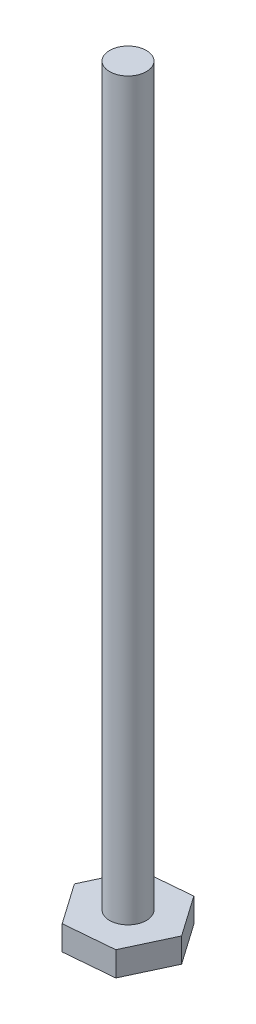
ISO-10303-21;
HEADER;
FILE_DESCRIPTION(('STEP AP214'),'2;1');
FILE_NAME('part.step','',(''),(''),'','','');
FILE_SCHEMA(('AUTOMOTIVE_DESIGN { 1 0 10303 214 1 1 1 1 }'));
ENDSEC;
DATA;
#1=APPLICATION_CONTEXT('core data for automotive mechanical design processes');
#2=APPLICATION_PROTOCOL_DEFINITION('international standard','automotive_design',2000,#1);
#3=PRODUCT_CONTEXT('',#1,'mechanical');
#4=PRODUCT('Part','Part','',(#3));
#5=PRODUCT_RELATED_PRODUCT_CATEGORY('part','',(#4));
#6=PRODUCT_DEFINITION_FORMATION('','',#4);
#7=PRODUCT_DEFINITION_CONTEXT('part definition',#1,'design');
#8=PRODUCT_DEFINITION('design','',#6,#7);
#9=PRODUCT_DEFINITION_SHAPE('','',#8);
#10=(LENGTH_UNIT() NAMED_UNIT(*) SI_UNIT(.MILLI.,.METRE.));
#11=(NAMED_UNIT(*) PLANE_ANGLE_UNIT() SI_UNIT($,.RADIAN.));
#12=(NAMED_UNIT(*) SI_UNIT($,.STERADIAN.) SOLID_ANGLE_UNIT());
#13=UNCERTAINTY_MEASURE_WITH_UNIT(LENGTH_MEASURE(1.E-05),#10,'distance_accuracy_value','');
#14=(GEOMETRIC_REPRESENTATION_CONTEXT(3) GLOBAL_UNCERTAINTY_ASSIGNED_CONTEXT((#13)) GLOBAL_UNIT_ASSIGNED_CONTEXT((#10,
#11,#12)) REPRESENTATION_CONTEXT('',''));
#15=CARTESIAN_POINT('',(0.,0.,0.));
#16=DIRECTION('',(0.,0.,1.));
#17=DIRECTION('',(1.,0.,0.));
#18=AXIS2_PLACEMENT_3D('',#15,#16,#17);
#19=CARTESIAN_POINT('',(-1.71040909944908,2.,3.66167093631516));
#20=DIRECTION('',(-0.0864980574249228,0.,-0.996252019351386));
#21=DIRECTION('',(-0.996252019351386,0.,0.0864980574249228));
#22=AXIS2_PLACEMENT_3D('',#19,#20,#21);
#23=PLANE('',#22);
#24=DIRECTION('',(0.996252019351386,0.,-0.0864980574249228));
#25=VECTOR('',#24,1.);
#26=CARTESIAN_POINT('',(-1.71040909944908,0.,3.66167093631516));
#27=LINE('',#26,#25);
#28=CARTESIAN_POINT('',(-1.71040909944908,0.,3.66167093631516));
#29=VERTEX_POINT('',#28);
#30=CARTESIAN_POINT('',(2.31589550142354,0.,3.31209319914455));
#31=VERTEX_POINT('',#30);
#32=EDGE_CURVE('E116',#29,#31,#27,.T.);
#33=ORIENTED_EDGE('',*,*,#32,.T.);
#34=DIRECTION('',(0.,-1.,0.));
#35=VECTOR('',#34,1.);
#36=CARTESIAN_POINT('',(2.31589550142354,2.,3.31209319914455));
#37=LINE('',#36,#35);
#38=CARTESIAN_POINT('',(2.31589550142354,2.,3.31209319914455));
#39=VERTEX_POINT('',#38);
#40=EDGE_CURVE('E11',#39,#31,#37,.T.);
#41=ORIENTED_EDGE('',*,*,#40,.F.);
#42=DIRECTION('',(0.996252019351386,0.,-0.0864980574249228));
#43=VECTOR('',#42,1.);
#44=CARTESIAN_POINT('',(-1.71040909944908,2.,3.66167093631516));
#45=LINE('',#44,#43);
#46=CARTESIAN_POINT('',(-1.71040909944908,2.,3.66167093631516));
#47=VERTEX_POINT('',#46);
#48=EDGE_CURVE('E127',#47,#39,#45,.T.);
#49=ORIENTED_EDGE('',*,*,#48,.F.);
#50=DIRECTION('',(0.,-1.,0.));
#51=VECTOR('',#50,1.);
#52=CARTESIAN_POINT('',(-1.71040909944908,2.,3.66167093631516));
#53=LINE('',#52,#51);
#54=EDGE_CURVE('E112',#47,#29,#53,.T.);
#55=ORIENTED_EDGE('',*,*,#54,.T.);
#56=EDGE_LOOP('',(#33,#41,#49,#55));
#57=FACE_BOUND('',#56,.T.);
#58=ADVANCED_FACE('F32',(#57),#23,.F.);
#59=CARTESIAN_POINT('',(2.31589550142354,2.,3.31209319914455));
#60=DIRECTION('',(-0.906028586042308,0.,-0.423216494567704));
#61=DIRECTION('',(-0.423216494567704,0.,0.906028586042308));
#62=AXIS2_PLACEMENT_3D('',#59,#60,#61);
#63=PLANE('',#62);
#64=DIRECTION('',(0.423216494567704,0.,-0.906028586042308));
#65=VECTOR('',#64,1.);
#66=CARTESIAN_POINT('',(2.31589550142354,0.,3.31209319914455));
#67=LINE('',#66,#65);
#68=CARTESIAN_POINT('',(4.02630460087262,0.,-0.349577737170614));
#69=VERTEX_POINT('',#68);
#70=EDGE_CURVE('E119',#31,#69,#67,.T.);
#71=ORIENTED_EDGE('',*,*,#70,.T.);
#72=DIRECTION('',(0.,-1.,0.));
#73=VECTOR('',#72,1.);
#74=CARTESIAN_POINT('',(4.02630460087262,2.,-0.349577737170614));
#75=LINE('',#74,#73);
#76=CARTESIAN_POINT('',(4.02630460087262,2.,-0.349577737170614));
#77=VERTEX_POINT('',#76);
#78=EDGE_CURVE('E40',#77,#69,#75,.T.);
#79=ORIENTED_EDGE('',*,*,#78,.F.);
#80=DIRECTION('',(0.423216494567704,0.,-0.906028586042308));
#81=VECTOR('',#80,1.);
#82=CARTESIAN_POINT('',(2.31589550142354,2.,3.31209319914455));
#83=LINE('',#82,#81);
#84=EDGE_CURVE('E85',#39,#77,#83,.T.);
#85=ORIENTED_EDGE('',*,*,#84,.F.);
#86=ORIENTED_EDGE('',*,*,#40,.T.);
#87=EDGE_LOOP('',(#71,#79,#85,#86));
#88=FACE_BOUND('',#87,.T.);
#89=ADVANCED_FACE('F152',(#88),#63,.F.);
#90=CARTESIAN_POINT('',(4.02630460087262,2.,-0.349577737170614));
#91=DIRECTION('',(-0.819530528617386,0.,0.573035524783681));
#92=DIRECTION('',(0.573035524783681,0.,0.819530528617385));
#93=AXIS2_PLACEMENT_3D('',#90,#91,#92);
#94=PLANE('',#93);
#95=DIRECTION('',(-0.573035524783681,0.,-0.819530528617386));
#96=VECTOR('',#95,1.);
#97=CARTESIAN_POINT('',(4.02630460087262,0.,-0.349577737170614));
#98=LINE('',#97,#96);
#99=CARTESIAN_POINT('',(1.71040909944908,0.,-3.66167093631516));
#100=VERTEX_POINT('',#99);
#101=EDGE_CURVE('E122',#69,#100,#98,.T.);
#102=ORIENTED_EDGE('',*,*,#101,.T.);
#103=DIRECTION('',(0.,-1.,0.));
#104=VECTOR('',#103,1.);
#105=CARTESIAN_POINT('',(1.71040909944908,2.,-3.66167093631516));
#106=LINE('',#105,#104);
#107=CARTESIAN_POINT('',(1.71040909944908,2.,-3.66167093631516));
#108=VERTEX_POINT('',#107);
#109=EDGE_CURVE('E107',#108,#100,#106,.T.);
#110=ORIENTED_EDGE('',*,*,#109,.F.);
#111=DIRECTION('',(-0.573035524783681,0.,-0.819530528617386));
#112=VECTOR('',#111,1.);
#113=CARTESIAN_POINT('',(4.02630460087262,2.,-0.349577737170614));
#114=LINE('',#113,#112);
#115=EDGE_CURVE('E98',#77,#108,#114,.T.);
#116=ORIENTED_EDGE('',*,*,#115,.F.);
#117=ORIENTED_EDGE('',*,*,#78,.T.);
#118=EDGE_LOOP('',(#102,#110,#116,#117));
#119=FACE_BOUND('',#118,.T.);
#120=ADVANCED_FACE('F133',(#119),#94,.F.);
#121=CARTESIAN_POINT('',(1.71040909944908,2.,-3.66167093631516));
#122=DIRECTION('',(0.0864980574249227,0.,0.996252019351386));
#123=DIRECTION('',(0.996252019351386,0.,-0.0864980574249227));
#124=AXIS2_PLACEMENT_3D('',#121,#122,#123);
#125=PLANE('',#124);
#126=DIRECTION('',(-0.996252019351386,0.,0.0864980574249227));
#127=VECTOR('',#126,1.);
#128=CARTESIAN_POINT('',(1.71040909944908,0.,-3.66167093631516));
#129=LINE('',#128,#127);
#130=CARTESIAN_POINT('',(-2.31589550142354,0.,-3.31209319914455));
#131=VERTEX_POINT('',#130);
#132=EDGE_CURVE('E106',#100,#131,#129,.T.);
#133=ORIENTED_EDGE('',*,*,#132,.T.);
#134=DIRECTION('',(0.,-1.,0.));
#135=VECTOR('',#134,1.);
#136=CARTESIAN_POINT('',(-2.31589550142354,2.,-3.31209319914455));
#137=LINE('',#136,#135);
#138=CARTESIAN_POINT('',(-2.31589550142354,2.,-3.31209319914455));
#139=VERTEX_POINT('',#138);
#140=EDGE_CURVE('E103',#139,#131,#137,.T.);
#141=ORIENTED_EDGE('',*,*,#140,.F.);
#142=DIRECTION('',(-0.996252019351386,0.,0.0864980574249227));
#143=VECTOR('',#142,1.);
#144=CARTESIAN_POINT('',(1.71040909944908,2.,-3.66167093631516));
#145=LINE('',#144,#143);
#146=EDGE_CURVE('E92',#108,#139,#145,.T.);
#147=ORIENTED_EDGE('',*,*,#146,.F.);
#148=ORIENTED_EDGE('',*,*,#109,.T.);
#149=EDGE_LOOP('',(#133,#141,#147,#148));
#150=FACE_BOUND('',#149,.T.);
#151=ADVANCED_FACE('F104',(#150),#125,.F.);
#152=CARTESIAN_POINT('',(-2.31589550142354,2.,-3.31209319914455));
#153=DIRECTION('',(0.906028586042308,0.,0.423216494567705));
#154=DIRECTION('',(0.423216494567705,0.,-0.906028586042308));
#155=AXIS2_PLACEMENT_3D('',#152,#153,#154);
#156=PLANE('',#155);
#157=DIRECTION('',(-0.423216494567705,0.,0.906028586042308));
#158=VECTOR('',#157,1.);
#159=CARTESIAN_POINT('',(-2.31589550142354,0.,-3.31209319914455));
#160=LINE('',#159,#158);
#161=CARTESIAN_POINT('',(-4.02630460087262,0.,0.349577737170613));
#162=VERTEX_POINT('',#161);
#163=EDGE_CURVE('E71',#131,#162,#160,.T.);
#164=ORIENTED_EDGE('',*,*,#163,.T.);
#165=DIRECTION('',(0.,-1.,0.));
#166=VECTOR('',#165,1.);
#167=CARTESIAN_POINT('',(-4.02630460087262,2.,0.349577737170613));
#168=LINE('',#167,#166);
#169=CARTESIAN_POINT('',(-4.02630460087262,2.,0.349577737170613));
#170=VERTEX_POINT('',#169);
#171=EDGE_CURVE('E108',#170,#162,#168,.T.);
#172=ORIENTED_EDGE('',*,*,#171,.F.);
#173=DIRECTION('',(-0.423216494567705,0.,0.906028586042308));
#174=VECTOR('',#173,1.);
#175=CARTESIAN_POINT('',(-2.31589550142354,2.,-3.31209319914455));
#176=LINE('',#175,#174);
#177=EDGE_CURVE('E96',#139,#170,#176,.T.);
#178=ORIENTED_EDGE('',*,*,#177,.F.);
#179=ORIENTED_EDGE('',*,*,#140,.T.);
#180=EDGE_LOOP('',(#164,#172,#178,#179));
#181=FACE_BOUND('',#180,.T.);
#182=ADVANCED_FACE('F110',(#181),#156,.F.);
#183=CARTESIAN_POINT('',(-4.02630460087262,2.,0.349577737170613));
#184=DIRECTION('',(0.819530528617385,0.,-0.573035524783681));
#185=DIRECTION('',(-0.573035524783681,0.,-0.819530528617385));
#186=AXIS2_PLACEMENT_3D('',#183,#184,#185);
#187=PLANE('',#186);
#188=DIRECTION('',(0.573035524783681,0.,0.819530528617385));
#189=VECTOR('',#188,1.);
#190=CARTESIAN_POINT('',(-4.02630460087262,0.,0.349577737170613));
#191=LINE('',#190,#189);
#192=EDGE_CURVE('E77',#162,#29,#191,.T.);
#193=ORIENTED_EDGE('',*,*,#192,.T.);
#194=ORIENTED_EDGE('',*,*,#54,.F.);
#195=DIRECTION('',(0.573035524783681,0.,0.819530528617385));
#196=VECTOR('',#195,1.);
#197=CARTESIAN_POINT('',(-4.02630460087262,2.,0.349577737170613));
#198=LINE('',#197,#196);
#199=EDGE_CURVE('E48',#170,#47,#198,.T.);
#200=ORIENTED_EDGE('',*,*,#199,.F.);
#201=ORIENTED_EDGE('',*,*,#171,.T.);
#202=EDGE_LOOP('',(#193,#194,#200,#201));
#203=FACE_BOUND('',#202,.T.);
#204=ADVANCED_FACE('F140',(#203),#187,.F.);
#205=CARTESIAN_POINT('',(0.,2.,0.));
#206=DIRECTION('',(0.,1.,0.));
#207=DIRECTION('',(0.,0.,1.));
#208=AXIS2_PLACEMENT_3D('',#205,#206,#207);
#209=PLANE('',#208);
#210=CARTESIAN_POINT('',(0.,2.,0.));
#211=DIRECTION('',(0.,1.,0.));
#212=DIRECTION('',(0.,0.,1.));
#213=AXIS2_PLACEMENT_3D('',#210,#211,#212);
#214=CIRCLE('',#213,1.5);
#215=CARTESIAN_POINT('',(0.,2.,1.5));
#216=VERTEX_POINT('',#215);
#217=EDGE_CURVE('E213',#216,#216,#214,.T.);
#218=ORIENTED_EDGE('',*,*,#217,.F.);
#219=EDGE_LOOP('',(#218));
#220=FACE_BOUND('',#219,.T.);
#221=ORIENTED_EDGE('',*,*,#48,.T.);
#222=ORIENTED_EDGE('',*,*,#84,.T.);
#223=ORIENTED_EDGE('',*,*,#115,.T.);
#224=ORIENTED_EDGE('',*,*,#146,.T.);
#225=ORIENTED_EDGE('',*,*,#177,.T.);
#226=ORIENTED_EDGE('',*,*,#199,.T.);
#227=EDGE_LOOP('',(#221,#222,#223,#224,#225,#226));
#228=FACE_BOUND('',#227,.T.);
#229=ADVANCED_FACE('F94',(#220,#228),#209,.T.);
#230=CARTESIAN_POINT('',(0.,0.,0.));
#231=DIRECTION('',(0.,1.,0.));
#232=DIRECTION('',(0.,0.,1.));
#233=AXIS2_PLACEMENT_3D('',#230,#231,#232);
#234=PLANE('',#233);
#235=ORIENTED_EDGE('',*,*,#32,.F.);
#236=ORIENTED_EDGE('',*,*,#192,.F.);
#237=ORIENTED_EDGE('',*,*,#163,.F.);
#238=ORIENTED_EDGE('',*,*,#132,.F.);
#239=ORIENTED_EDGE('',*,*,#101,.F.);
#240=ORIENTED_EDGE('',*,*,#70,.F.);
#241=EDGE_LOOP('',(#235,#236,#237,#238,#239,#240));
#242=FACE_BOUND('',#241,.T.);
#243=ADVANCED_FACE('F136',(#242),#234,.F.);
#244=CARTESIAN_POINT('',(0.,62.,0.));
#245=DIRECTION('',(0.,-1.,0.));
#246=DIRECTION('',(0.,0.,-1.));
#247=AXIS2_PLACEMENT_3D('',#244,#245,#246);
#248=CYLINDRICAL_SURFACE('',#247,1.5);
#249=CARTESIAN_POINT('',(0.,62.,0.));
#250=DIRECTION('',(0.,1.,0.));
#251=DIRECTION('',(0.,0.,1.));
#252=AXIS2_PLACEMENT_3D('',#249,#250,#251);
#253=CIRCLE('',#252,1.5);
#254=CARTESIAN_POINT('',(0.,62.,1.5));
#255=VERTEX_POINT('',#254);
#256=EDGE_CURVE('E120',#255,#255,#253,.T.);
#257=ORIENTED_EDGE('',*,*,#256,.F.);
#258=EDGE_LOOP('',(#257));
#259=FACE_BOUND('',#258,.T.);
#260=ORIENTED_EDGE('',*,*,#217,.T.);
#261=EDGE_LOOP('',(#260));
#262=FACE_BOUND('',#261,.T.);
#263=ADVANCED_FACE('F184',(#259,#262),#248,.T.);
#264=CARTESIAN_POINT('',(0.,62.,0.));
#265=DIRECTION('',(0.,1.,0.));
#266=DIRECTION('',(0.,0.,1.));
#267=AXIS2_PLACEMENT_3D('',#264,#265,#266);
#268=PLANE('',#267);
#269=ORIENTED_EDGE('',*,*,#256,.T.);
#270=EDGE_LOOP('',(#269));
#271=FACE_BOUND('',#270,.T.);
#272=ADVANCED_FACE('F197',(#271),#268,.T.);
#273=CLOSED_SHELL('',(#58,#89,#120,#151,#182,#204,#229,#243,#263,#272));
#274=MANIFOLD_SOLID_BREP('B2',#273);
#275=ADVANCED_BREP_SHAPE_REPRESENTATION('',(#18,#274),#14);
#276=SHAPE_DEFINITION_REPRESENTATION(#9,#275);
ENDSEC;
END-ISO-10303-21;
